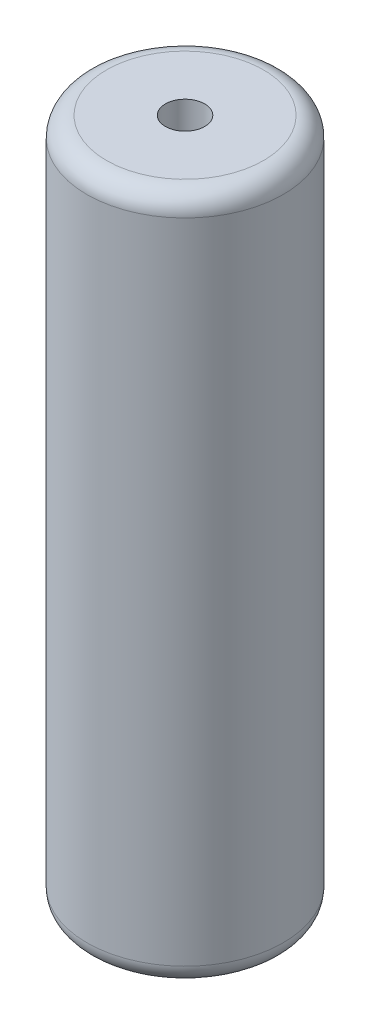
ISO-10303-21;
HEADER;
FILE_DESCRIPTION(('STEP AP214'),'2;1');
FILE_NAME('part.step','',(''),(''),'','','');
FILE_SCHEMA(('AUTOMOTIVE_DESIGN { 1 0 10303 214 1 1 1 1 }'));
ENDSEC;
DATA;
#1=APPLICATION_CONTEXT('core data for automotive mechanical design processes');
#2=APPLICATION_PROTOCOL_DEFINITION('international standard','automotive_design',2000,#1);
#3=PRODUCT_CONTEXT('',#1,'mechanical');
#4=PRODUCT('Part','Part','',(#3));
#5=PRODUCT_RELATED_PRODUCT_CATEGORY('part','',(#4));
#6=PRODUCT_DEFINITION_FORMATION('','',#4);
#7=PRODUCT_DEFINITION_CONTEXT('part definition',#1,'design');
#8=PRODUCT_DEFINITION('design','',#6,#7);
#9=PRODUCT_DEFINITION_SHAPE('','',#8);
#10=(LENGTH_UNIT() NAMED_UNIT(*) SI_UNIT(.MILLI.,.METRE.));
#11=(NAMED_UNIT(*) PLANE_ANGLE_UNIT() SI_UNIT($,.RADIAN.));
#12=(NAMED_UNIT(*) SI_UNIT($,.STERADIAN.) SOLID_ANGLE_UNIT());
#13=UNCERTAINTY_MEASURE_WITH_UNIT(LENGTH_MEASURE(1.E-05),#10,'distance_accuracy_value','');
#14=(GEOMETRIC_REPRESENTATION_CONTEXT(3) GLOBAL_UNCERTAINTY_ASSIGNED_CONTEXT((#13)) GLOBAL_UNIT_ASSIGNED_CONTEXT((#10,
#11,#12)) REPRESENTATION_CONTEXT('',''));
#15=CARTESIAN_POINT('',(0.,0.,0.));
#16=DIRECTION('',(0.,0.,1.));
#17=DIRECTION('',(1.,0.,0.));
#18=AXIS2_PLACEMENT_3D('',#15,#16,#17);
#19=CARTESIAN_POINT('',(0.,70.,0.));
#20=DIRECTION('',(0.,-1.,0.));
#21=DIRECTION('',(0.,0.,-1.));
#22=AXIS2_PLACEMENT_3D('',#19,#20,#21);
#23=CYLINDRICAL_SURFACE('',#22,10.);
#24=CARTESIAN_POINT('',(0.,2.,0.));
#25=DIRECTION('',(0.,1.,0.));
#26=DIRECTION('',(0.,0.,1.));
#27=AXIS2_PLACEMENT_3D('',#24,#25,#26);
#28=CIRCLE('',#27,10.);
#29=CARTESIAN_POINT('',(0.,2.,10.));
#30=VERTEX_POINT('',#29);
#31=EDGE_CURVE('E53',#30,#30,#28,.T.);
#32=ORIENTED_EDGE('',*,*,#31,.T.);
#33=EDGE_LOOP('',(#32));
#34=FACE_BOUND('',#33,.T.);
#35=CARTESIAN_POINT('',(0.,68.,0.));
#36=DIRECTION('',(0.,1.,0.));
#37=DIRECTION('',(0.,0.,1.));
#38=AXIS2_PLACEMENT_3D('',#35,#36,#37);
#39=CIRCLE('',#38,10.);
#40=CARTESIAN_POINT('',(0.,68.,10.));
#41=VERTEX_POINT('',#40);
#42=EDGE_CURVE('E57',#41,#41,#39,.F.);
#43=ORIENTED_EDGE('',*,*,#42,.T.);
#44=EDGE_LOOP('',(#43));
#45=FACE_BOUND('',#44,.T.);
#46=ADVANCED_FACE('F42',(#34,#45),#23,.T.);
#47=CARTESIAN_POINT('',(0.,70.,0.));
#48=DIRECTION('',(0.,1.,0.));
#49=DIRECTION('',(0.,0.,1.));
#50=AXIS2_PLACEMENT_3D('',#47,#48,#49);
#51=PLANE('',#50);
#52=CARTESIAN_POINT('',(0.,70.,0.));
#53=DIRECTION('',(0.,1.,0.));
#54=DIRECTION('',(0.,0.,1.));
#55=AXIS2_PLACEMENT_3D('',#52,#53,#54);
#56=CIRCLE('',#55,8.);
#57=CARTESIAN_POINT('',(0.,70.,8.));
#58=VERTEX_POINT('',#57);
#59=EDGE_CURVE('E12',#58,#58,#56,.T.);
#60=ORIENTED_EDGE('',*,*,#59,.T.);
#61=EDGE_LOOP('',(#60));
#62=FACE_BOUND('',#61,.T.);
#63=CARTESIAN_POINT('',(0.,70.,0.));
#64=DIRECTION('',(0.,1.,0.));
#65=DIRECTION('',(0.,0.,1.));
#66=AXIS2_PLACEMENT_3D('',#63,#64,#65);
#67=CIRCLE('',#66,2.);
#68=CARTESIAN_POINT('',(0.,70.,2.));
#69=VERTEX_POINT('',#68);
#70=EDGE_CURVE('E63',#69,#69,#67,.T.);
#71=ORIENTED_EDGE('',*,*,#70,.F.);
#72=EDGE_LOOP('',(#71));
#73=FACE_BOUND('',#72,.T.);
#74=ADVANCED_FACE('F86',(#62,#73),#51,.T.);
#75=CARTESIAN_POINT('',(0.,0.,0.));
#76=DIRECTION('',(0.,1.,0.));
#77=DIRECTION('',(0.,0.,1.));
#78=AXIS2_PLACEMENT_3D('',#75,#76,#77);
#79=PLANE('',#78);
#80=CARTESIAN_POINT('',(0.,0.,0.));
#81=DIRECTION('',(0.,-1.,0.));
#82=DIRECTION('',(0.,0.,-1.));
#83=AXIS2_PLACEMENT_3D('',#80,#81,#82);
#84=CIRCLE('',#83,2.);
#85=CARTESIAN_POINT('',(0.,0.,-2.));
#86=VERTEX_POINT('',#85);
#87=EDGE_CURVE('E69',#86,#86,#84,.T.);
#88=ORIENTED_EDGE('',*,*,#87,.F.);
#89=EDGE_LOOP('',(#88));
#90=FACE_BOUND('',#89,.T.);
#91=CARTESIAN_POINT('',(0.,0.,0.));
#92=DIRECTION('',(0.,1.,0.));
#93=DIRECTION('',(0.,0.,1.));
#94=AXIS2_PLACEMENT_3D('',#91,#92,#93);
#95=CIRCLE('',#94,8.);
#96=CARTESIAN_POINT('',(0.,0.,8.));
#97=VERTEX_POINT('',#96);
#98=EDGE_CURVE('E49',#97,#97,#95,.F.);
#99=ORIENTED_EDGE('',*,*,#98,.T.);
#100=EDGE_LOOP('',(#99));
#101=FACE_BOUND('',#100,.T.);
#102=ADVANCED_FACE('F83',(#90,#101),#79,.F.);
#103=CARTESIAN_POINT('',(0.,10.,0.));
#104=DIRECTION('',(0.,1.,0.));
#105=DIRECTION('',(0.,0.,1.));
#106=AXIS2_PLACEMENT_3D('',#103,#104,#105);
#107=CYLINDRICAL_SURFACE('',#106,2.);
#108=CARTESIAN_POINT('',(0.,10.,0.));
#109=DIRECTION('',(0.,1.,0.));
#110=DIRECTION('',(0.,0.,1.));
#111=AXIS2_PLACEMENT_3D('',#108,#109,#110);
#112=CIRCLE('',#111,2.);
#113=CARTESIAN_POINT('',(0.,10.,2.));
#114=VERTEX_POINT('',#113);
#115=EDGE_CURVE('E62',#114,#114,#112,.T.);
#116=ORIENTED_EDGE('',*,*,#115,.F.);
#117=EDGE_LOOP('',(#116));
#118=FACE_BOUND('',#117,.T.);
#119=ORIENTED_EDGE('',*,*,#70,.T.);
#120=EDGE_LOOP('',(#119));
#121=FACE_BOUND('',#120,.T.);
#122=ADVANCED_FACE('F85',(#118,#121),#107,.F.);
#123=CARTESIAN_POINT('',(0.,10.,0.));
#124=DIRECTION('',(0.,1.,0.));
#125=DIRECTION('',(0.,0.,1.));
#126=AXIS2_PLACEMENT_3D('',#123,#124,#125);
#127=PLANE('',#126);
#128=ORIENTED_EDGE('',*,*,#115,.T.);
#129=EDGE_LOOP('',(#128));
#130=FACE_BOUND('',#129,.T.);
#131=ADVANCED_FACE('F92',(#130),#127,.T.);
#132=CARTESIAN_POINT('',(0.,2.,0.));
#133=DIRECTION('',(0.,1.,0.));
#134=DIRECTION('',(0.,0.,1.));
#135=AXIS2_PLACEMENT_3D('',#132,#133,#134);
#136=TOROIDAL_SURFACE('',#135,8.,2.);
#137=ORIENTED_EDGE('',*,*,#98,.F.);
#138=EDGE_LOOP('',(#137));
#139=FACE_BOUND('',#138,.T.);
#140=ORIENTED_EDGE('',*,*,#31,.F.);
#141=EDGE_LOOP('',(#140));
#142=FACE_BOUND('',#141,.T.);
#143=ADVANCED_FACE('F102',(#139,#142),#136,.T.);
#144=CARTESIAN_POINT('',(0.,68.,0.));
#145=DIRECTION('',(0.,1.,0.));
#146=DIRECTION('',(0.,0.,1.));
#147=AXIS2_PLACEMENT_3D('',#144,#145,#146);
#148=TOROIDAL_SURFACE('',#147,8.,2.);
#149=ORIENTED_EDGE('',*,*,#42,.F.);
#150=EDGE_LOOP('',(#149));
#151=FACE_BOUND('',#150,.T.);
#152=ORIENTED_EDGE('',*,*,#59,.F.);
#153=EDGE_LOOP('',(#152));
#154=FACE_BOUND('',#153,.T.);
#155=ADVANCED_FACE('F44',(#151,#154),#148,.T.);
#156=CARTESIAN_POINT('',(0.,5.,0.));
#157=DIRECTION('',(0.,-1.,0.));
#158=DIRECTION('',(0.,0.,-1.));
#159=AXIS2_PLACEMENT_3D('',#156,#157,#158);
#160=CYLINDRICAL_SURFACE('',#159,2.);
#161=CARTESIAN_POINT('',(0.,5.,0.));
#162=DIRECTION('',(0.,-1.,0.));
#163=DIRECTION('',(0.,0.,-1.));
#164=AXIS2_PLACEMENT_3D('',#161,#162,#163);
#165=CIRCLE('',#164,2.);
#166=CARTESIAN_POINT('',(0.,5.,-2.));
#167=VERTEX_POINT('',#166);
#168=EDGE_CURVE('E66',#167,#167,#165,.T.);
#169=ORIENTED_EDGE('',*,*,#168,.F.);
#170=EDGE_LOOP('',(#169));
#171=FACE_BOUND('',#170,.T.);
#172=ORIENTED_EDGE('',*,*,#87,.T.);
#173=EDGE_LOOP('',(#172));
#174=FACE_BOUND('',#173,.T.);
#175=ADVANCED_FACE('F77',(#171,#174),#160,.F.);
#176=CARTESIAN_POINT('',(0.,5.,0.));
#177=DIRECTION('',(0.,-1.,0.));
#178=DIRECTION('',(0.,0.,-1.));
#179=AXIS2_PLACEMENT_3D('',#176,#177,#178);
#180=PLANE('',#179);
#181=ORIENTED_EDGE('',*,*,#168,.T.);
#182=EDGE_LOOP('',(#181));
#183=FACE_BOUND('',#182,.T.);
#184=ADVANCED_FACE('F75',(#183),#180,.T.);
#185=CLOSED_SHELL('',(#46,#74,#102,#122,#131,#143,#155,#175,#184));
#186=MANIFOLD_SOLID_BREP('B2',#185);
#187=ADVANCED_BREP_SHAPE_REPRESENTATION('',(#18,#186),#14);
#188=SHAPE_DEFINITION_REPRESENTATION(#9,#187);
ENDSEC;
END-ISO-10303-21;
